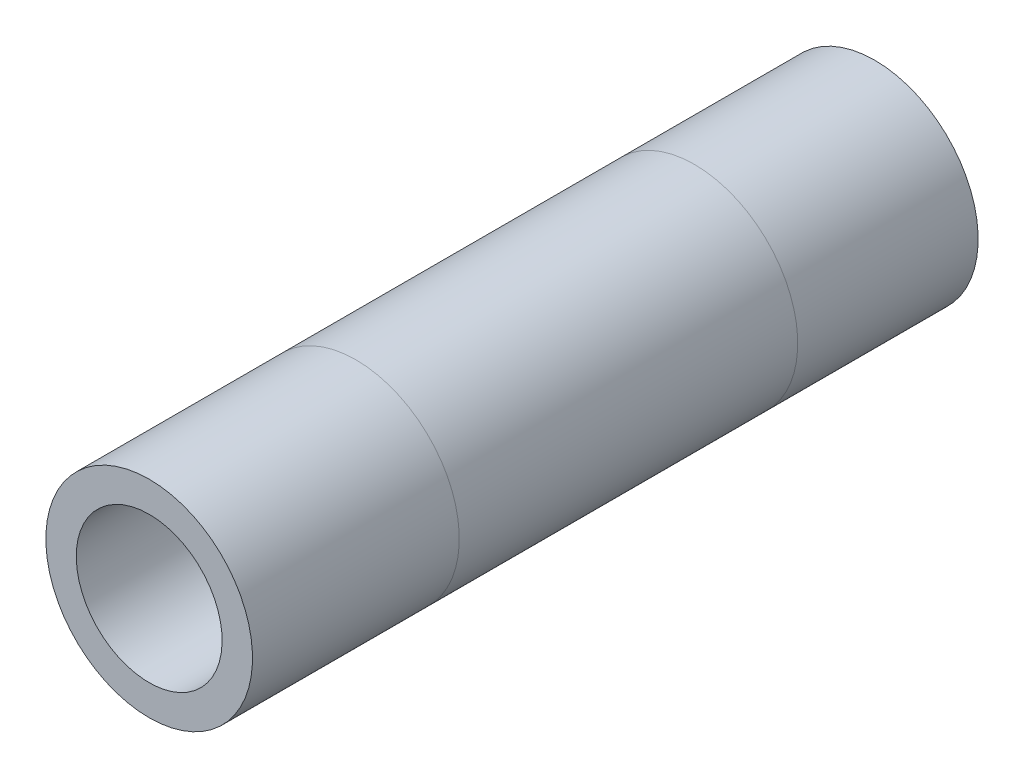
ISO-10303-21;
HEADER;
FILE_DESCRIPTION(('STEP AP214'),'2;1');
FILE_NAME('part.step','',(''),(''),'','','');
FILE_SCHEMA(('AUTOMOTIVE_DESIGN { 1 0 10303 214 1 1 1 1 }'));
ENDSEC;
DATA;
#1=APPLICATION_CONTEXT('core data for automotive mechanical design processes');
#2=APPLICATION_PROTOCOL_DEFINITION('international standard','automotive_design',2000,#1);
#3=PRODUCT_CONTEXT('',#1,'mechanical');
#4=PRODUCT('Part','Part','',(#3));
#5=PRODUCT_RELATED_PRODUCT_CATEGORY('part','',(#4));
#6=PRODUCT_DEFINITION_FORMATION('','',#4);
#7=PRODUCT_DEFINITION_CONTEXT('part definition',#1,'design');
#8=PRODUCT_DEFINITION('design','',#6,#7);
#9=PRODUCT_DEFINITION_SHAPE('','',#8);
#10=(LENGTH_UNIT() NAMED_UNIT(*) SI_UNIT(.MILLI.,.METRE.));
#11=(NAMED_UNIT(*) PLANE_ANGLE_UNIT() SI_UNIT($,.RADIAN.));
#12=(NAMED_UNIT(*) SI_UNIT($,.STERADIAN.) SOLID_ANGLE_UNIT());
#13=UNCERTAINTY_MEASURE_WITH_UNIT(LENGTH_MEASURE(1.E-05),#10,'distance_accuracy_value','');
#14=(GEOMETRIC_REPRESENTATION_CONTEXT(3) GLOBAL_UNCERTAINTY_ASSIGNED_CONTEXT((#13)) GLOBAL_UNIT_ASSIGNED_CONTEXT((#10,
#11,#12)) REPRESENTATION_CONTEXT('',''));
#15=CARTESIAN_POINT('',(0.,0.,0.));
#16=DIRECTION('',(0.,0.,1.));
#17=DIRECTION('',(1.,0.,0.));
#18=AXIS2_PLACEMENT_3D('',#15,#16,#17);
#19=CARTESIAN_POINT('',(-3.54776316349143E-12,4.12339024087231E-13,-23.5579999999996));
#20=DIRECTION('',(0.,0.,-1.));
#21=DIRECTION('',(0.,1.,0.));
#22=AXIS2_PLACEMENT_3D('',#19,#20,#21);
#23=PLANE('',#22);
#24=CARTESIAN_POINT('',(-3.54776316349143E-12,4.12339024087231E-13,-23.5579999999996));
#25=DIRECTION('',(0.,0.,-1.));
#26=DIRECTION('',(0.,1.,0.));
#27=AXIS2_PLACEMENT_3D('',#24,#25,#26);
#28=CIRCLE('',#27,9.525);
#29=CARTESIAN_POINT('',(-3.54776316349143E-12,9.52500000000041,-23.5579999999995));
#30=VERTEX_POINT('',#29);
#31=EDGE_CURVE('E76',#30,#30,#28,.T.);
#32=ORIENTED_EDGE('',*,*,#31,.F.);
#33=EDGE_LOOP('',(#32));
#34=FACE_BOUND('',#33,.T.);
#35=CARTESIAN_POINT('',(-3.54776316349143E-12,4.12339024087231E-13,-23.5579999999996));
#36=DIRECTION('',(0.,0.,-1.));
#37=DIRECTION('',(0.,1.,0.));
#38=AXIS2_PLACEMENT_3D('',#35,#36,#37);
#39=CIRCLE('',#38,13.49375);
#40=CARTESIAN_POINT('',(-3.54776316349143E-12,13.4937500000004,-23.5579999999995));
#41=VERTEX_POINT('',#40);
#42=EDGE_CURVE('E71',#41,#41,#39,.T.);
#43=ORIENTED_EDGE('',*,*,#42,.T.);
#44=EDGE_LOOP('',(#43));
#45=FACE_BOUND('',#44,.T.);
#46=ADVANCED_FACE('F57',(#34,#45),#23,.T.);
#47=CARTESIAN_POINT('',(0.,-1.36488594629783E-13,71.2020686433389));
#48=DIRECTION('',(0.,0.,-1.));
#49=DIRECTION('',(0.,1.,0.));
#50=AXIS2_PLACEMENT_3D('',#47,#48,#49);
#51=PLANE('',#50);
#52=CARTESIAN_POINT('',(0.,0.,71.2020686433389));
#53=DIRECTION('',(0.,0.,-1.));
#54=DIRECTION('',(0.,1.,0.));
#55=AXIS2_PLACEMENT_3D('',#52,#53,#54);
#56=CIRCLE('',#55,9.525);
#57=CARTESIAN_POINT('',(0.,9.52499999999998,71.2020686433389));
#58=VERTEX_POINT('',#57);
#59=EDGE_CURVE('E79',#58,#58,#56,.T.);
#60=ORIENTED_EDGE('',*,*,#59,.T.);
#61=EDGE_LOOP('',(#60));
#62=FACE_BOUND('',#61,.T.);
#63=CARTESIAN_POINT('',(0.,-1.36488594629783E-13,71.2020686433389));
#64=DIRECTION('',(0.,0.,-1.));
#65=DIRECTION('',(0.,1.,0.));
#66=AXIS2_PLACEMENT_3D('',#63,#64,#65);
#67=CIRCLE('',#66,13.49375);
#68=CARTESIAN_POINT('',(0.,13.4937499999999,71.2020686433389));
#69=VERTEX_POINT('',#68);
#70=EDGE_CURVE('E11',#69,#69,#67,.T.);
#71=ORIENTED_EDGE('',*,*,#70,.F.);
#72=EDGE_LOOP('',(#71));
#73=FACE_BOUND('',#72,.T.);
#74=ADVANCED_FACE('F89',(#62,#73),#51,.F.);
#75=CARTESIAN_POINT('',(-3.54776316349143E-12,4.12339024087231E-13,-23.5579999999996));
#76=DIRECTION('',(0.,0.,1.));
#77=DIRECTION('',(1.,0.,0.));
#78=AXIS2_PLACEMENT_3D('',#75,#76,#77);
#79=CYLINDRICAL_SURFACE('',#78,13.49375);
#80=CARTESIAN_POINT('',(-2.66289676111836E-12,2.93544272273919E-13,0.));
#81=DIRECTION('',(0.,0.,-1.));
#82=DIRECTION('',(0.,1.,0.));
#83=AXIS2_PLACEMENT_3D('',#80,#81,#82);
#84=CIRCLE('',#83,13.49375);
#85=CARTESIAN_POINT('',(-2.66289676111836E-12,13.4937500000003,0.));
#86=VERTEX_POINT('',#85);
#87=EDGE_CURVE('E67',#86,#86,#84,.T.);
#88=ORIENTED_EDGE('',*,*,#87,.T.);
#89=EDGE_LOOP('',(#88));
#90=FACE_BOUND('',#89,.T.);
#91=ORIENTED_EDGE('',*,*,#42,.F.);
#92=EDGE_LOOP('',(#91));
#93=FACE_BOUND('',#92,.T.);
#94=ADVANCED_FACE('F115',(#90,#93),#79,.T.);
#95=CARTESIAN_POINT('',(0.,1.14346050265384E-13,0.));
#96=DIRECTION('',(0.,0.,1.));
#97=DIRECTION('',(0.,-1.,0.));
#98=AXIS2_PLACEMENT_3D('',#95,#96,#97);
#99=CYLINDRICAL_SURFACE('',#98,13.49375);
#100=CARTESIAN_POINT('',(0.,0.,44.2020686433389));
#101=DIRECTION('',(0.,0.,-1.));
#102=DIRECTION('',(0.,1.,0.));
#103=AXIS2_PLACEMENT_3D('',#100,#101,#102);
#104=CIRCLE('',#103,13.49375);
#105=CARTESIAN_POINT('',(0.,13.49375,44.2020686433389));
#106=VERTEX_POINT('',#105);
#107=EDGE_CURVE('E63',#106,#106,#104,.T.);
#108=ORIENTED_EDGE('',*,*,#107,.T.);
#109=EDGE_LOOP('',(#108));
#110=FACE_BOUND('',#109,.T.);
#111=ORIENTED_EDGE('',*,*,#87,.F.);
#112=EDGE_LOOP('',(#111));
#113=FACE_BOUND('',#112,.T.);
#114=ADVANCED_FACE('F117',(#110,#113),#99,.T.);
#115=CARTESIAN_POINT('',(0.,-1.11649752930915E-13,44.2020686433389));
#116=DIRECTION('',(0.,0.,1.));
#117=DIRECTION('',(0.,-1.,0.));
#118=AXIS2_PLACEMENT_3D('',#115,#116,#117);
#119=CYLINDRICAL_SURFACE('',#118,13.49375);
#120=ORIENTED_EDGE('',*,*,#70,.T.);
#121=EDGE_LOOP('',(#120));
#122=FACE_BOUND('',#121,.T.);
#123=ORIENTED_EDGE('',*,*,#107,.F.);
#124=EDGE_LOOP('',(#123));
#125=FACE_BOUND('',#124,.T.);
#126=ADVANCED_FACE('F107',(#122,#125),#119,.T.);
#127=CARTESIAN_POINT('',(-3.69800790453448E-12,4.32509624615851E-13,-27.5579999999995));
#128=DIRECTION('',(0.,0.,1.));
#129=DIRECTION('',(1.,0.,0.));
#130=AXIS2_PLACEMENT_3D('',#127,#128,#129);
#131=CYLINDRICAL_SURFACE('',#130,9.525);
#132=CARTESIAN_POINT('',(-2.66289676111836E-12,2.93544272273919E-13,0.));
#133=DIRECTION('',(0.,0.,-1.));
#134=DIRECTION('',(0.,1.,0.));
#135=AXIS2_PLACEMENT_3D('',#132,#133,#134);
#136=CIRCLE('',#135,9.525);
#137=CARTESIAN_POINT('',(-2.66289676111836E-12,9.52500000000029,0.));
#138=VERTEX_POINT('',#137);
#139=EDGE_CURVE('E80',#138,#138,#136,.T.);
#140=ORIENTED_EDGE('',*,*,#139,.F.);
#141=EDGE_LOOP('',(#140));
#142=FACE_BOUND('',#141,.T.);
#143=ORIENTED_EDGE('',*,*,#31,.T.);
#144=EDGE_LOOP('',(#143));
#145=FACE_BOUND('',#144,.T.);
#146=ADVANCED_FACE('F97',(#142,#145),#131,.F.);
#147=CARTESIAN_POINT('',(0.,1.14346050265384E-13,0.));
#148=DIRECTION('',(0.,0.,1.));
#149=DIRECTION('',(0.,-1.,0.));
#150=AXIS2_PLACEMENT_3D('',#147,#148,#149);
#151=CYLINDRICAL_SURFACE('',#150,9.525);
#152=CARTESIAN_POINT('',(0.,0.,44.2020686433389));
#153=DIRECTION('',(0.,0.,-1.));
#154=DIRECTION('',(0.,1.,0.));
#155=AXIS2_PLACEMENT_3D('',#152,#153,#154);
#156=CIRCLE('',#155,9.525);
#157=CARTESIAN_POINT('',(0.,9.525,44.2020686433389));
#158=VERTEX_POINT('',#157);
#159=EDGE_CURVE('E83',#158,#158,#156,.T.);
#160=ORIENTED_EDGE('',*,*,#159,.F.);
#161=EDGE_LOOP('',(#160));
#162=FACE_BOUND('',#161,.T.);
#163=ORIENTED_EDGE('',*,*,#139,.T.);
#164=EDGE_LOOP('',(#163));
#165=FACE_BOUND('',#164,.T.);
#166=ADVANCED_FACE('F95',(#162,#165),#151,.F.);
#167=CARTESIAN_POINT('',(0.,0.,44.2020686433389));
#168=DIRECTION('',(0.,0.,1.));
#169=DIRECTION('',(0.,-1.,0.));
#170=AXIS2_PLACEMENT_3D('',#167,#168,#169);
#171=CYLINDRICAL_SURFACE('',#170,9.525);
#172=ORIENTED_EDGE('',*,*,#59,.F.);
#173=EDGE_LOOP('',(#172));
#174=FACE_BOUND('',#173,.T.);
#175=ORIENTED_EDGE('',*,*,#159,.T.);
#176=EDGE_LOOP('',(#175));
#177=FACE_BOUND('',#176,.T.);
#178=ADVANCED_FACE('F92',(#174,#177),#171,.F.);
#179=CLOSED_SHELL('',(#46,#74,#94,#114,#126,#146,#166,#178));
#180=MANIFOLD_SOLID_BREP('B2',#179);
#181=ADVANCED_BREP_SHAPE_REPRESENTATION('',(#18,#180),#14);
#182=SHAPE_DEFINITION_REPRESENTATION(#9,#181);
ENDSEC;
END-ISO-10303-21;
